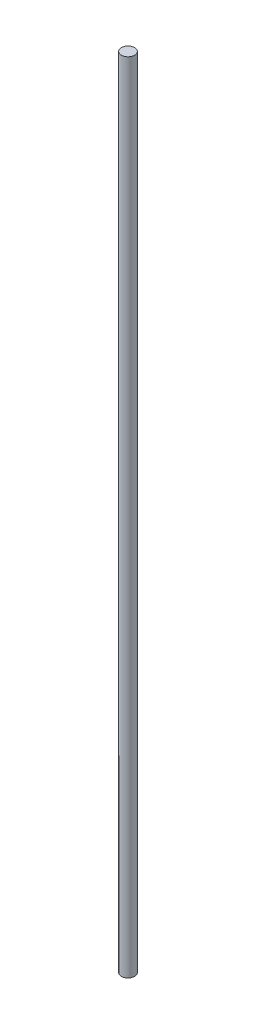
ISO-10303-21;
HEADER;
FILE_DESCRIPTION(('STEP AP214'),'2;1');
FILE_NAME('part.step','',(''),(''),'','','');
FILE_SCHEMA(('AUTOMOTIVE_DESIGN { 1 0 10303 214 1 1 1 1 }'));
ENDSEC;
DATA;
#1=APPLICATION_CONTEXT('core data for automotive mechanical design processes');
#2=APPLICATION_PROTOCOL_DEFINITION('international standard','automotive_design',2000,#1);
#3=PRODUCT_CONTEXT('',#1,'mechanical');
#4=PRODUCT('Part','Part','',(#3));
#5=PRODUCT_RELATED_PRODUCT_CATEGORY('part','',(#4));
#6=PRODUCT_DEFINITION_FORMATION('','',#4);
#7=PRODUCT_DEFINITION_CONTEXT('part definition',#1,'design');
#8=PRODUCT_DEFINITION('design','',#6,#7);
#9=PRODUCT_DEFINITION_SHAPE('','',#8);
#10=(LENGTH_UNIT() NAMED_UNIT(*) SI_UNIT(.MILLI.,.METRE.));
#11=(NAMED_UNIT(*) PLANE_ANGLE_UNIT() SI_UNIT($,.RADIAN.));
#12=(NAMED_UNIT(*) SI_UNIT($,.STERADIAN.) SOLID_ANGLE_UNIT());
#13=UNCERTAINTY_MEASURE_WITH_UNIT(LENGTH_MEASURE(1.E-05),#10,'distance_accuracy_value','');
#14=(GEOMETRIC_REPRESENTATION_CONTEXT(3) GLOBAL_UNCERTAINTY_ASSIGNED_CONTEXT((#13)) GLOBAL_UNIT_ASSIGNED_CONTEXT((#10,
#11,#12)) REPRESENTATION_CONTEXT('',''));
#15=CARTESIAN_POINT('',(0.,0.,0.));
#16=DIRECTION('',(0.,0.,1.));
#17=DIRECTION('',(1.,0.,0.));
#18=AXIS2_PLACEMENT_3D('',#15,#16,#17);
#19=CARTESIAN_POINT('',(0.,87.5,0.));
#20=DIRECTION('',(0.,-1.,0.));
#21=DIRECTION('',(0.,0.,-1.));
#22=AXIS2_PLACEMENT_3D('',#19,#20,#21);
#23=CYLINDRICAL_SURFACE('',#22,1.5);
#24=CARTESIAN_POINT('',(0.,-87.5,0.));
#25=DIRECTION('',(0.,1.,0.));
#26=DIRECTION('',(0.,0.,1.));
#27=AXIS2_PLACEMENT_3D('',#24,#25,#26);
#28=CIRCLE('',#27,1.5);
#29=CARTESIAN_POINT('',(0.,-87.5,1.5));
#30=VERTEX_POINT('',#29);
#31=EDGE_CURVE('E10',#30,#30,#28,.T.);
#32=ORIENTED_EDGE('',*,*,#31,.T.);
#33=EDGE_LOOP('',(#32));
#34=FACE_BOUND('',#33,.T.);
#35=CARTESIAN_POINT('',(0.,93.5,0.));
#36=DIRECTION('',(0.,1.,0.));
#37=DIRECTION('',(0.,0.,1.));
#38=AXIS2_PLACEMENT_3D('',#35,#36,#37);
#39=CIRCLE('',#38,1.5);
#40=CARTESIAN_POINT('',(0.,93.5,1.5));
#41=VERTEX_POINT('',#40);
#42=EDGE_CURVE('E45',#41,#41,#39,.T.);
#43=ORIENTED_EDGE('',*,*,#42,.F.);
#44=EDGE_LOOP('',(#43));
#45=FACE_BOUND('',#44,.T.);
#46=ADVANCED_FACE('F38',(#34,#45),#23,.T.);
#47=CARTESIAN_POINT('',(0.,-87.5,0.));
#48=DIRECTION('',(0.,1.,0.));
#49=DIRECTION('',(0.,0.,1.));
#50=AXIS2_PLACEMENT_3D('',#47,#48,#49);
#51=PLANE('',#50);
#52=ORIENTED_EDGE('',*,*,#31,.F.);
#53=EDGE_LOOP('',(#52));
#54=FACE_BOUND('',#53,.T.);
#55=ADVANCED_FACE('F55',(#54),#51,.F.);
#56=CARTESIAN_POINT('',(0.,93.5,0.));
#57=DIRECTION('',(0.,1.,0.));
#58=DIRECTION('',(0.,0.,1.));
#59=AXIS2_PLACEMENT_3D('',#56,#57,#58);
#60=PLANE('',#59);
#61=ORIENTED_EDGE('',*,*,#42,.T.);
#62=EDGE_LOOP('',(#61));
#63=FACE_BOUND('',#62,.T.);
#64=ADVANCED_FACE('F52',(#63),#60,.T.);
#65=CLOSED_SHELL('',(#46,#55,#64));
#66=MANIFOLD_SOLID_BREP('B2',#65);
#67=ADVANCED_BREP_SHAPE_REPRESENTATION('',(#18,#66),#14);
#68=SHAPE_DEFINITION_REPRESENTATION(#9,#67);
ENDSEC;
END-ISO-10303-21;
